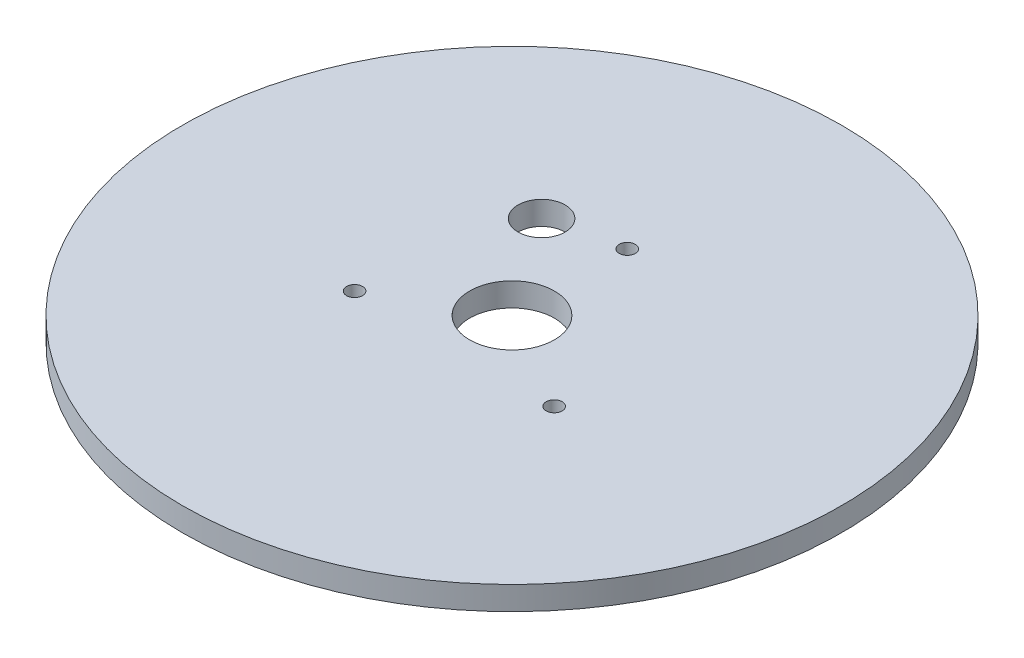
ISO-10303-21;
HEADER;
FILE_DESCRIPTION(('STEP AP214'),'2;1');
FILE_NAME('part.step','',(''),(''),'','','');
FILE_SCHEMA(('AUTOMOTIVE_DESIGN { 1 0 10303 214 1 1 1 1 }'));
ENDSEC;
DATA;
#1=APPLICATION_CONTEXT('core data for automotive mechanical design processes');
#2=APPLICATION_PROTOCOL_DEFINITION('international standard','automotive_design',2000,#1);
#3=PRODUCT_CONTEXT('',#1,'mechanical');
#4=PRODUCT('Part','Part','',(#3));
#5=PRODUCT_RELATED_PRODUCT_CATEGORY('part','',(#4));
#6=PRODUCT_DEFINITION_FORMATION('','',#4);
#7=PRODUCT_DEFINITION_CONTEXT('part definition',#1,'design');
#8=PRODUCT_DEFINITION('design','',#6,#7);
#9=PRODUCT_DEFINITION_SHAPE('','',#8);
#10=(LENGTH_UNIT() NAMED_UNIT(*) SI_UNIT(.MILLI.,.METRE.));
#11=(NAMED_UNIT(*) PLANE_ANGLE_UNIT() SI_UNIT($,.RADIAN.));
#12=(NAMED_UNIT(*) SI_UNIT($,.STERADIAN.) SOLID_ANGLE_UNIT());
#13=UNCERTAINTY_MEASURE_WITH_UNIT(LENGTH_MEASURE(1.E-05),#10,'distance_accuracy_value','');
#14=(GEOMETRIC_REPRESENTATION_CONTEXT(3) GLOBAL_UNCERTAINTY_ASSIGNED_CONTEXT((#13)) GLOBAL_UNIT_ASSIGNED_CONTEXT((#10,
#11,#12)) REPRESENTATION_CONTEXT('',''));
#15=CARTESIAN_POINT('',(0.,0.,0.));
#16=DIRECTION('',(0.,0.,1.));
#17=DIRECTION('',(1.,0.,0.));
#18=AXIS2_PLACEMENT_3D('',#15,#16,#17);
#19=CARTESIAN_POINT('',(0.,6.35,0.));
#20=DIRECTION('',(0.,1.,0.));
#21=DIRECTION('',(0.,0.,1.));
#22=AXIS2_PLACEMENT_3D('',#19,#20,#21);
#23=PLANE('',#22);
#24=CARTESIAN_POINT('',(26.9238637782543,6.35,15.5444999999999));
#25=DIRECTION('',(0.,1.,0.));
#26=DIRECTION('',(0.,0.,1.));
#27=AXIS2_PLACEMENT_3D('',#24,#25,#26);
#28=CIRCLE('',#27,2.159);
#29=CARTESIAN_POINT('',(26.9238637782543,6.35,17.7034999999999));
#30=VERTEX_POINT('',#29);
#31=EDGE_CURVE('E67',#30,#30,#28,.T.);
#32=ORIENTED_EDGE('',*,*,#31,.F.);
#33=EDGE_LOOP('',(#32));
#34=FACE_BOUND('',#33,.T.);
#35=CARTESIAN_POINT('',(0.,6.35,-31.089));
#36=DIRECTION('',(0.,1.,0.));
#37=DIRECTION('',(0.,0.,1.));
#38=AXIS2_PLACEMENT_3D('',#35,#36,#37);
#39=CIRCLE('',#38,2.159);
#40=CARTESIAN_POINT('',(0.,6.35,-28.93));
#41=VERTEX_POINT('',#40);
#42=EDGE_CURVE('E55',#41,#41,#39,.T.);
#43=ORIENTED_EDGE('',*,*,#42,.F.);
#44=EDGE_LOOP('',(#43));
#45=FACE_BOUND('',#44,.T.);
#46=CARTESIAN_POINT('',(0.,6.35,0.));
#47=DIRECTION('',(0.,1.,0.));
#48=DIRECTION('',(0.,0.,1.));
#49=AXIS2_PLACEMENT_3D('',#46,#47,#48);
#50=CIRCLE('',#49,88.9);
#51=CARTESIAN_POINT('',(0.,6.35,88.9));
#52=VERTEX_POINT('',#51);
#53=EDGE_CURVE('E12',#52,#52,#50,.T.);
#54=ORIENTED_EDGE('',*,*,#53,.T.);
#55=EDGE_LOOP('',(#54));
#56=FACE_BOUND('',#55,.T.);
#57=CARTESIAN_POINT('',(0.,6.35,0.));
#58=DIRECTION('',(0.,1.,0.));
#59=DIRECTION('',(0.,0.,1.));
#60=AXIS2_PLACEMENT_3D('',#57,#58,#59);
#61=CIRCLE('',#60,11.43);
#62=CARTESIAN_POINT('',(0.,6.35,11.43));
#63=VERTEX_POINT('',#62);
#64=EDGE_CURVE('E50',#63,#63,#61,.T.);
#65=ORIENTED_EDGE('',*,*,#64,.F.);
#66=EDGE_LOOP('',(#65));
#67=FACE_BOUND('',#66,.T.);
#68=CARTESIAN_POINT('',(-18.6481170986451,6.35,-26.6322712639238));
#69=DIRECTION('',(0.,1.,0.));
#70=DIRECTION('',(0.,0.,1.));
#71=AXIS2_PLACEMENT_3D('',#68,#69,#70);
#72=CIRCLE('',#71,6.35);
#73=CARTESIAN_POINT('',(-18.6481170986451,6.35,-20.2822712639238));
#74=VERTEX_POINT('',#73);
#75=EDGE_CURVE('E61',#74,#74,#72,.T.);
#76=ORIENTED_EDGE('',*,*,#75,.F.);
#77=EDGE_LOOP('',(#76));
#78=FACE_BOUND('',#77,.T.);
#79=CARTESIAN_POINT('',(-26.9238637782543,6.35,15.5444999999999));
#80=DIRECTION('',(0.,1.,0.));
#81=DIRECTION('',(0.,0.,1.));
#82=AXIS2_PLACEMENT_3D('',#79,#80,#81);
#83=CIRCLE('',#82,2.159);
#84=CARTESIAN_POINT('',(-26.9238637782543,6.35,17.7034999999999));
#85=VERTEX_POINT('',#84);
#86=EDGE_CURVE('E73',#85,#85,#83,.T.);
#87=ORIENTED_EDGE('',*,*,#86,.F.);
#88=EDGE_LOOP('',(#87));
#89=FACE_BOUND('',#88,.T.);
#90=ADVANCED_FACE('F39',(#34,#45,#56,#67,#78,#89),#23,.T.);
#91=CARTESIAN_POINT('',(0.,0.,0.));
#92=DIRECTION('',(0.,1.,0.));
#93=DIRECTION('',(0.,0.,1.));
#94=AXIS2_PLACEMENT_3D('',#91,#92,#93);
#95=PLANE('',#94);
#96=CARTESIAN_POINT('',(26.9238637782543,0.,15.5444999999999));
#97=DIRECTION('',(0.,1.,0.));
#98=DIRECTION('',(0.,0.,1.));
#99=AXIS2_PLACEMENT_3D('',#96,#97,#98);
#100=CIRCLE('',#99,2.159);
#101=CARTESIAN_POINT('',(26.9238637782543,0.,17.7034999999999));
#102=VERTEX_POINT('',#101);
#103=EDGE_CURVE('E70',#102,#102,#100,.T.);
#104=ORIENTED_EDGE('',*,*,#103,.T.);
#105=EDGE_LOOP('',(#104));
#106=FACE_BOUND('',#105,.T.);
#107=CARTESIAN_POINT('',(0.,0.,-31.089));
#108=DIRECTION('',(0.,1.,0.));
#109=DIRECTION('',(0.,0.,1.));
#110=AXIS2_PLACEMENT_3D('',#107,#108,#109);
#111=CIRCLE('',#110,2.159);
#112=CARTESIAN_POINT('',(0.,0.,-28.93));
#113=VERTEX_POINT('',#112);
#114=EDGE_CURVE('E58',#113,#113,#111,.T.);
#115=ORIENTED_EDGE('',*,*,#114,.T.);
#116=EDGE_LOOP('',(#115));
#117=FACE_BOUND('',#116,.T.);
#118=CARTESIAN_POINT('',(0.,0.,0.));
#119=DIRECTION('',(0.,1.,0.));
#120=DIRECTION('',(0.,0.,1.));
#121=AXIS2_PLACEMENT_3D('',#118,#119,#120);
#122=CIRCLE('',#121,88.9);
#123=CARTESIAN_POINT('',(0.,0.,88.9));
#124=VERTEX_POINT('',#123);
#125=EDGE_CURVE('E43',#124,#124,#122,.T.);
#126=ORIENTED_EDGE('',*,*,#125,.F.);
#127=EDGE_LOOP('',(#126));
#128=FACE_BOUND('',#127,.T.);
#129=CARTESIAN_POINT('',(0.,0.,0.));
#130=DIRECTION('',(0.,1.,0.));
#131=DIRECTION('',(0.,0.,1.));
#132=AXIS2_PLACEMENT_3D('',#129,#130,#131);
#133=CIRCLE('',#132,11.43);
#134=CARTESIAN_POINT('',(0.,0.,11.43));
#135=VERTEX_POINT('',#134);
#136=EDGE_CURVE('E52',#135,#135,#133,.T.);
#137=ORIENTED_EDGE('',*,*,#136,.T.);
#138=EDGE_LOOP('',(#137));
#139=FACE_BOUND('',#138,.T.);
#140=CARTESIAN_POINT('',(-18.6481170986451,0.,-26.6322712639238));
#141=DIRECTION('',(0.,1.,0.));
#142=DIRECTION('',(0.,0.,1.));
#143=AXIS2_PLACEMENT_3D('',#140,#141,#142);
#144=CIRCLE('',#143,6.35);
#145=CARTESIAN_POINT('',(-18.6481170986451,0.,-20.2822712639238));
#146=VERTEX_POINT('',#145);
#147=EDGE_CURVE('E64',#146,#146,#144,.T.);
#148=ORIENTED_EDGE('',*,*,#147,.T.);
#149=EDGE_LOOP('',(#148));
#150=FACE_BOUND('',#149,.T.);
#151=CARTESIAN_POINT('',(-26.9238637782543,0.,15.5444999999999));
#152=DIRECTION('',(0.,1.,0.));
#153=DIRECTION('',(0.,0.,1.));
#154=AXIS2_PLACEMENT_3D('',#151,#152,#153);
#155=CIRCLE('',#154,2.159);
#156=CARTESIAN_POINT('',(-26.9238637782543,0.,17.7034999999999));
#157=VERTEX_POINT('',#156);
#158=EDGE_CURVE('E76',#157,#157,#155,.T.);
#159=ORIENTED_EDGE('',*,*,#158,.T.);
#160=EDGE_LOOP('',(#159));
#161=FACE_BOUND('',#160,.T.);
#162=ADVANCED_FACE('F86',(#106,#117,#128,#139,#150,#161),#95,.F.);
#163=CARTESIAN_POINT('',(0.,6.35,0.));
#164=DIRECTION('',(0.,-1.,0.));
#165=DIRECTION('',(0.,0.,-1.));
#166=AXIS2_PLACEMENT_3D('',#163,#164,#165);
#167=CYLINDRICAL_SURFACE('',#166,88.9);
#168=ORIENTED_EDGE('',*,*,#53,.F.);
#169=EDGE_LOOP('',(#168));
#170=FACE_BOUND('',#169,.T.);
#171=ORIENTED_EDGE('',*,*,#125,.T.);
#172=EDGE_LOOP('',(#171));
#173=FACE_BOUND('',#172,.T.);
#174=ADVANCED_FACE('F41',(#170,#173),#167,.T.);
#175=CARTESIAN_POINT('',(0.,6.35,0.));
#176=DIRECTION('',(0.,-1.,0.));
#177=DIRECTION('',(0.,0.,-1.));
#178=AXIS2_PLACEMENT_3D('',#175,#176,#177);
#179=CYLINDRICAL_SURFACE('',#178,11.43);
#180=ORIENTED_EDGE('',*,*,#64,.T.);
#181=EDGE_LOOP('',(#180));
#182=FACE_BOUND('',#181,.T.);
#183=ORIENTED_EDGE('',*,*,#136,.F.);
#184=EDGE_LOOP('',(#183));
#185=FACE_BOUND('',#184,.T.);
#186=ADVANCED_FACE('F96',(#182,#185),#179,.F.);
#187=CARTESIAN_POINT('',(0.,6.35,-31.089));
#188=DIRECTION('',(0.,-1.,0.));
#189=DIRECTION('',(0.,0.,-1.));
#190=AXIS2_PLACEMENT_3D('',#187,#188,#189);
#191=CYLINDRICAL_SURFACE('',#190,2.159);
#192=ORIENTED_EDGE('',*,*,#42,.T.);
#193=EDGE_LOOP('',(#192));
#194=FACE_BOUND('',#193,.T.);
#195=ORIENTED_EDGE('',*,*,#114,.F.);
#196=EDGE_LOOP('',(#195));
#197=FACE_BOUND('',#196,.T.);
#198=ADVANCED_FACE('F99',(#194,#197),#191,.F.);
#199=CARTESIAN_POINT('',(-18.6481170986451,6.35,-26.6322712639238));
#200=DIRECTION('',(0.,-1.,0.));
#201=DIRECTION('',(0.,0.,-1.));
#202=AXIS2_PLACEMENT_3D('',#199,#200,#201);
#203=CYLINDRICAL_SURFACE('',#202,6.35);
#204=ORIENTED_EDGE('',*,*,#75,.T.);
#205=EDGE_LOOP('',(#204));
#206=FACE_BOUND('',#205,.T.);
#207=ORIENTED_EDGE('',*,*,#147,.F.);
#208=EDGE_LOOP('',(#207));
#209=FACE_BOUND('',#208,.T.);
#210=ADVANCED_FACE('F103',(#206,#209),#203,.F.);
#211=CARTESIAN_POINT('',(26.9238637782543,6.35,15.5444999999999));
#212=DIRECTION('',(0.,-1.,0.));
#213=DIRECTION('',(0.,0.,-1.));
#214=AXIS2_PLACEMENT_3D('',#211,#212,#213);
#215=CYLINDRICAL_SURFACE('',#214,2.159);
#216=ORIENTED_EDGE('',*,*,#31,.T.);
#217=EDGE_LOOP('',(#216));
#218=FACE_BOUND('',#217,.T.);
#219=ORIENTED_EDGE('',*,*,#103,.F.);
#220=EDGE_LOOP('',(#219));
#221=FACE_BOUND('',#220,.T.);
#222=ADVANCED_FACE('F107',(#218,#221),#215,.F.);
#223=CARTESIAN_POINT('',(-26.9238637782543,6.35,15.5444999999999));
#224=DIRECTION('',(0.,-1.,0.));
#225=DIRECTION('',(0.,0.,-1.));
#226=AXIS2_PLACEMENT_3D('',#223,#224,#225);
#227=CYLINDRICAL_SURFACE('',#226,2.159);
#228=ORIENTED_EDGE('',*,*,#86,.T.);
#229=EDGE_LOOP('',(#228));
#230=FACE_BOUND('',#229,.T.);
#231=ORIENTED_EDGE('',*,*,#158,.F.);
#232=EDGE_LOOP('',(#231));
#233=FACE_BOUND('',#232,.T.);
#234=ADVANCED_FACE('F82',(#230,#233),#227,.F.);
#235=CLOSED_SHELL('',(#90,#162,#174,#186,#198,#210,#222,#234));
#236=MANIFOLD_SOLID_BREP('B2',#235);
#237=ADVANCED_BREP_SHAPE_REPRESENTATION('',(#18,#236),#14);
#238=SHAPE_DEFINITION_REPRESENTATION(#9,#237);
ENDSEC;
END-ISO-10303-21;
